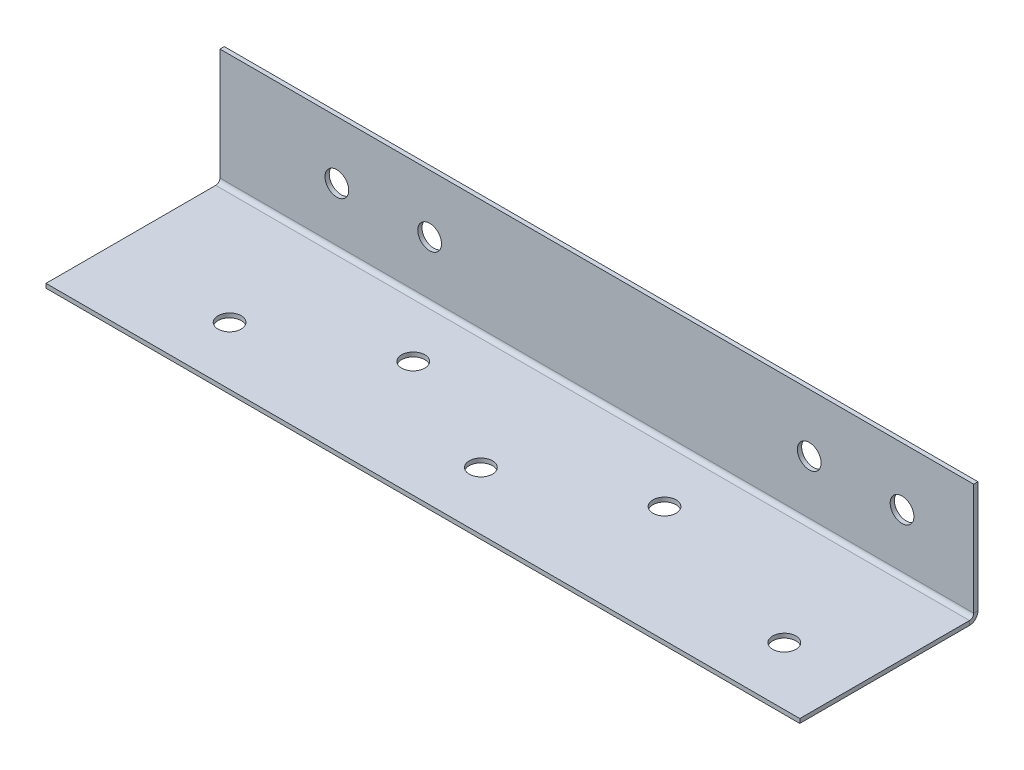
ISO-10303-21;
HEADER;
FILE_DESCRIPTION(('STEP AP214'),'2;1');
FILE_NAME('part.step','',(''),(''),'','','');
FILE_SCHEMA(('AUTOMOTIVE_DESIGN { 1 0 10303 214 1 1 1 1 }'));
ENDSEC;
DATA;
#1=APPLICATION_CONTEXT('core data for automotive mechanical design processes');
#2=APPLICATION_PROTOCOL_DEFINITION('international standard','automotive_design',2000,#1);
#3=PRODUCT_CONTEXT('',#1,'mechanical');
#4=PRODUCT('Part','Part','',(#3));
#5=PRODUCT_RELATED_PRODUCT_CATEGORY('part','',(#4));
#6=PRODUCT_DEFINITION_FORMATION('','',#4);
#7=PRODUCT_DEFINITION_CONTEXT('part definition',#1,'design');
#8=PRODUCT_DEFINITION('design','',#6,#7);
#9=PRODUCT_DEFINITION_SHAPE('','',#8);
#10=(LENGTH_UNIT() NAMED_UNIT(*) SI_UNIT(.MILLI.,.METRE.));
#11=(NAMED_UNIT(*) PLANE_ANGLE_UNIT() SI_UNIT($,.RADIAN.));
#12=(NAMED_UNIT(*) SI_UNIT($,.STERADIAN.) SOLID_ANGLE_UNIT());
#13=UNCERTAINTY_MEASURE_WITH_UNIT(LENGTH_MEASURE(1.E-05),#10,'distance_accuracy_value','');
#14=(GEOMETRIC_REPRESENTATION_CONTEXT(3) GLOBAL_UNCERTAINTY_ASSIGNED_CONTEXT((#13)) GLOBAL_UNIT_ASSIGNED_CONTEXT((#10,
#11,#12)) REPRESENTATION_CONTEXT('',''));
#15=CARTESIAN_POINT('',(0.,0.,0.));
#16=DIRECTION('',(0.,0.,1.));
#17=DIRECTION('',(1.,0.,0.));
#18=AXIS2_PLACEMENT_3D('',#15,#16,#17);
#19=CARTESIAN_POINT('',(-65.,-0.7366,15.));
#20=DIRECTION('',(-1.,0.,0.));
#21=DIRECTION('',(0.,0.,1.));
#22=AXIS2_PLACEMENT_3D('',#19,#20,#21);
#23=PLANE('',#22);
#24=DIRECTION('',(0.,0.,1.));
#25=VECTOR('',#24,1.);
#26=CARTESIAN_POINT('',(-65.,0.,15.));
#27=LINE('',#26,#25);
#28=CARTESIAN_POINT('',(-65.,0.,-14.2634));
#29=VERTEX_POINT('',#28);
#30=CARTESIAN_POINT('',(-65.,0.,15.));
#31=VERTEX_POINT('',#30);
#32=EDGE_CURVE('E89',#29,#31,#27,.T.);
#33=ORIENTED_EDGE('',*,*,#32,.F.);
#34=DIRECTION('',(0.,-1.,0.));
#35=VECTOR('',#34,1.);
#36=CARTESIAN_POINT('',(-65.,0.,-14.2634));
#37=LINE('',#36,#35);
#38=CARTESIAN_POINT('',(-65.,-0.736600000000018,-14.2634));
#39=VERTEX_POINT('',#38);
#40=EDGE_CURVE('E168',#29,#39,#37,.T.);
#41=ORIENTED_EDGE('',*,*,#40,.T.);
#42=DIRECTION('',(0.,0.,1.));
#43=VECTOR('',#42,1.);
#44=CARTESIAN_POINT('',(-65.,-0.7366,15.));
#45=LINE('',#44,#43);
#46=CARTESIAN_POINT('',(-65.,-0.7366,15.));
#47=VERTEX_POINT('',#46);
#48=EDGE_CURVE('E97',#39,#47,#45,.T.);
#49=ORIENTED_EDGE('',*,*,#48,.T.);
#50=DIRECTION('',(0.,1.,0.));
#51=VECTOR('',#50,1.);
#52=CARTESIAN_POINT('',(-65.,-0.7366,15.));
#53=LINE('',#52,#51);
#54=EDGE_CURVE('E48',#47,#31,#53,.T.);
#55=ORIENTED_EDGE('',*,*,#54,.T.);
#56=EDGE_LOOP('',(#33,#41,#49,#55));
#57=FACE_BOUND('',#56,.T.);
#58=ADVANCED_FACE('F39',(#57),#23,.T.);
#59=CARTESIAN_POINT('',(0.,-0.7366,0.));
#60=DIRECTION('',(0.,-1.,0.));
#61=DIRECTION('',(0.,0.,-1.));
#62=AXIS2_PLACEMENT_3D('',#59,#60,#61);
#63=PLANE('',#62);
#64=CARTESIAN_POINT('',(0.,-0.7366,5.));
#65=DIRECTION('',(0.,1.,0.));
#66=DIRECTION('',(0.,0.,1.));
#67=AXIS2_PLACEMENT_3D('',#64,#65,#66);
#68=CIRCLE('',#67,2.);
#69=CARTESIAN_POINT('',(0.,-0.7366,7.));
#70=VERTEX_POINT('',#69);
#71=EDGE_CURVE('E90',#70,#70,#68,.T.);
#72=ORIENTED_EDGE('',*,*,#71,.T.);
#73=EDGE_LOOP('',(#72));
#74=FACE_BOUND('',#73,.T.);
#75=CARTESIAN_POINT('',(-21.6666666666667,-0.7366,-5.));
#76=DIRECTION('',(0.,1.,0.));
#77=DIRECTION('',(0.,0.,1.));
#78=AXIS2_PLACEMENT_3D('',#75,#76,#77);
#79=CIRCLE('',#78,2.);
#80=CARTESIAN_POINT('',(-21.6666666666667,-0.7366,-2.99999999999999));
#81=VERTEX_POINT('',#80);
#82=EDGE_CURVE('E201',#81,#81,#79,.T.);
#83=ORIENTED_EDGE('',*,*,#82,.T.);
#84=EDGE_LOOP('',(#83));
#85=FACE_BOUND('',#84,.T.);
#86=CARTESIAN_POINT('',(-43.3333333333334,-0.7366,5.));
#87=DIRECTION('',(0.,1.,0.));
#88=DIRECTION('',(0.,0.,1.));
#89=AXIS2_PLACEMENT_3D('',#86,#87,#88);
#90=CIRCLE('',#89,2.);
#91=CARTESIAN_POINT('',(-43.3333333333334,-0.7366,7.00000000000001));
#92=VERTEX_POINT('',#91);
#93=EDGE_CURVE('E195',#92,#92,#90,.T.);
#94=ORIENTED_EDGE('',*,*,#93,.T.);
#95=EDGE_LOOP('',(#94));
#96=FACE_BOUND('',#95,.T.);
#97=CARTESIAN_POINT('',(52.33,-0.7366,5.));
#98=DIRECTION('',(0.,1.,0.));
#99=DIRECTION('',(0.,0.,1.));
#100=AXIS2_PLACEMENT_3D('',#97,#98,#99);
#101=CIRCLE('',#100,2.);
#102=CARTESIAN_POINT('',(52.33,-0.7366,7.00000000000001));
#103=VERTEX_POINT('',#102);
#104=EDGE_CURVE('E189',#103,#103,#101,.T.);
#105=ORIENTED_EDGE('',*,*,#104,.T.);
#106=EDGE_LOOP('',(#105));
#107=FACE_BOUND('',#106,.T.);
#108=CARTESIAN_POINT('',(21.67,-0.7366,-5.));
#109=DIRECTION('',(0.,1.,0.));
#110=DIRECTION('',(0.,0.,1.));
#111=AXIS2_PLACEMENT_3D('',#108,#109,#110);
#112=CIRCLE('',#111,2.);
#113=CARTESIAN_POINT('',(21.67,-0.7366,-2.99999999999999));
#114=VERTEX_POINT('',#113);
#115=EDGE_CURVE('E183',#114,#114,#112,.T.);
#116=ORIENTED_EDGE('',*,*,#115,.T.);
#117=EDGE_LOOP('',(#116));
#118=FACE_BOUND('',#117,.T.);
#119=ORIENTED_EDGE('',*,*,#48,.F.);
#120=DIRECTION('',(-1.,0.,0.));
#121=VECTOR('',#120,1.);
#122=CARTESIAN_POINT('',(-65.,-0.736600000000018,-14.2634));
#123=LINE('',#122,#121);
#124=CARTESIAN_POINT('',(65.,-0.7366,-14.2634));
#125=VERTEX_POINT('',#124);
#126=EDGE_CURVE('E163',#39,#125,#123,.F.);
#127=ORIENTED_EDGE('',*,*,#126,.T.);
#128=DIRECTION('',(0.,0.,-1.));
#129=VECTOR('',#128,1.);
#130=CARTESIAN_POINT('',(65.,-0.7366,15.));
#131=LINE('',#130,#129);
#132=CARTESIAN_POINT('',(65.,-0.7366,15.));
#133=VERTEX_POINT('',#132);
#134=EDGE_CURVE('E95',#133,#125,#131,.T.);
#135=ORIENTED_EDGE('',*,*,#134,.F.);
#136=DIRECTION('',(1.,0.,0.));
#137=VECTOR('',#136,1.);
#138=CARTESIAN_POINT('',(-65.,-0.7366,15.));
#139=LINE('',#138,#137);
#140=EDGE_CURVE('E81',#47,#133,#139,.T.);
#141=ORIENTED_EDGE('',*,*,#140,.F.);
#142=EDGE_LOOP('',(#119,#127,#135,#141));
#143=FACE_BOUND('',#142,.T.);
#144=ADVANCED_FACE('F216',(#74,#85,#96,#107,#118,#143),#63,.T.);
#145=CARTESIAN_POINT('',(0.,0.,0.));
#146=DIRECTION('',(0.,-1.,0.));
#147=DIRECTION('',(0.,0.,-1.));
#148=AXIS2_PLACEMENT_3D('',#145,#146,#147);
#149=PLANE('',#148);
#150=CARTESIAN_POINT('',(0.,0.,5.));
#151=DIRECTION('',(0.,1.,0.));
#152=DIRECTION('',(0.,0.,1.));
#153=AXIS2_PLACEMENT_3D('',#150,#151,#152);
#154=CIRCLE('',#153,2.);
#155=CARTESIAN_POINT('',(0.,0.,7.));
#156=VERTEX_POINT('',#155);
#157=EDGE_CURVE('E204',#156,#156,#154,.T.);
#158=ORIENTED_EDGE('',*,*,#157,.F.);
#159=EDGE_LOOP('',(#158));
#160=FACE_BOUND('',#159,.T.);
#161=CARTESIAN_POINT('',(-21.6666666666667,0.,-5.));
#162=DIRECTION('',(0.,1.,0.));
#163=DIRECTION('',(0.,0.,1.));
#164=AXIS2_PLACEMENT_3D('',#161,#162,#163);
#165=CIRCLE('',#164,2.);
#166=CARTESIAN_POINT('',(-21.6666666666667,0.,-2.99999999999999));
#167=VERTEX_POINT('',#166);
#168=EDGE_CURVE('E198',#167,#167,#165,.T.);
#169=ORIENTED_EDGE('',*,*,#168,.F.);
#170=EDGE_LOOP('',(#169));
#171=FACE_BOUND('',#170,.T.);
#172=CARTESIAN_POINT('',(-43.3333333333334,0.,5.));
#173=DIRECTION('',(0.,1.,0.));
#174=DIRECTION('',(0.,0.,1.));
#175=AXIS2_PLACEMENT_3D('',#172,#173,#174);
#176=CIRCLE('',#175,2.);
#177=CARTESIAN_POINT('',(-43.3333333333334,0.,7.00000000000001));
#178=VERTEX_POINT('',#177);
#179=EDGE_CURVE('E192',#178,#178,#176,.T.);
#180=ORIENTED_EDGE('',*,*,#179,.F.);
#181=EDGE_LOOP('',(#180));
#182=FACE_BOUND('',#181,.T.);
#183=CARTESIAN_POINT('',(52.33,0.,5.));
#184=DIRECTION('',(0.,1.,0.));
#185=DIRECTION('',(0.,0.,1.));
#186=AXIS2_PLACEMENT_3D('',#183,#184,#185);
#187=CIRCLE('',#186,2.);
#188=CARTESIAN_POINT('',(52.33,0.,7.00000000000001));
#189=VERTEX_POINT('',#188);
#190=EDGE_CURVE('E186',#189,#189,#187,.T.);
#191=ORIENTED_EDGE('',*,*,#190,.F.);
#192=EDGE_LOOP('',(#191));
#193=FACE_BOUND('',#192,.T.);
#194=CARTESIAN_POINT('',(21.67,0.,-5.));
#195=DIRECTION('',(0.,1.,0.));
#196=DIRECTION('',(0.,0.,1.));
#197=AXIS2_PLACEMENT_3D('',#194,#195,#196);
#198=CIRCLE('',#197,2.);
#199=CARTESIAN_POINT('',(21.67,0.,-2.99999999999999));
#200=VERTEX_POINT('',#199);
#201=EDGE_CURVE('E180',#200,#200,#198,.T.);
#202=ORIENTED_EDGE('',*,*,#201,.F.);
#203=EDGE_LOOP('',(#202));
#204=FACE_BOUND('',#203,.T.);
#205=DIRECTION('',(-1.,0.,0.));
#206=VECTOR('',#205,1.);
#207=CARTESIAN_POINT('',(-65.,0.,-14.2634));
#208=LINE('',#207,#206);
#209=CARTESIAN_POINT('',(65.,0.,-14.2634));
#210=VERTEX_POINT('',#209);
#211=EDGE_CURVE('E174',#29,#210,#208,.F.);
#212=ORIENTED_EDGE('',*,*,#211,.F.);
#213=ORIENTED_EDGE('',*,*,#32,.T.);
#214=DIRECTION('',(1.,0.,0.));
#215=VECTOR('',#214,1.);
#216=CARTESIAN_POINT('',(-65.,0.,15.));
#217=LINE('',#216,#215);
#218=CARTESIAN_POINT('',(65.,0.,15.));
#219=VERTEX_POINT('',#218);
#220=EDGE_CURVE('E79',#31,#219,#217,.T.);
#221=ORIENTED_EDGE('',*,*,#220,.T.);
#222=DIRECTION('',(0.,0.,-1.));
#223=VECTOR('',#222,1.);
#224=CARTESIAN_POINT('',(65.,0.,15.));
#225=LINE('',#224,#223);
#226=EDGE_CURVE('E84',#219,#210,#225,.T.);
#227=ORIENTED_EDGE('',*,*,#226,.T.);
#228=EDGE_LOOP('',(#212,#213,#221,#227));
#229=FACE_BOUND('',#228,.T.);
#230=ADVANCED_FACE('F92',(#160,#171,#182,#193,#204,#229),#149,.F.);
#231=CARTESIAN_POINT('',(65.,-0.7366,15.));
#232=DIRECTION('',(1.,0.,0.));
#233=DIRECTION('',(0.,0.,-1.));
#234=AXIS2_PLACEMENT_3D('',#231,#232,#233);
#235=PLANE('',#234);
#236=DIRECTION('',(0.,-1.,0.));
#237=VECTOR('',#236,1.);
#238=CARTESIAN_POINT('',(65.,0.,-14.2634));
#239=LINE('',#238,#237);
#240=EDGE_CURVE('E86',#210,#125,#239,.T.);
#241=ORIENTED_EDGE('',*,*,#240,.F.);
#242=ORIENTED_EDGE('',*,*,#226,.F.);
#243=DIRECTION('',(0.,1.,0.));
#244=VECTOR('',#243,1.);
#245=CARTESIAN_POINT('',(65.,-0.7366,15.));
#246=LINE('',#245,#244);
#247=EDGE_CURVE('E11',#133,#219,#246,.T.);
#248=ORIENTED_EDGE('',*,*,#247,.F.);
#249=ORIENTED_EDGE('',*,*,#134,.T.);
#250=EDGE_LOOP('',(#241,#242,#248,#249));
#251=FACE_BOUND('',#250,.T.);
#252=ADVANCED_FACE('F41',(#251),#235,.T.);
#253=CARTESIAN_POINT('',(-65.,-0.7366,15.));
#254=DIRECTION('',(0.,0.,1.));
#255=DIRECTION('',(1.,0.,0.));
#256=AXIS2_PLACEMENT_3D('',#253,#254,#255);
#257=PLANE('',#256);
#258=ORIENTED_EDGE('',*,*,#220,.F.);
#259=ORIENTED_EDGE('',*,*,#54,.F.);
#260=ORIENTED_EDGE('',*,*,#140,.T.);
#261=ORIENTED_EDGE('',*,*,#247,.T.);
#262=EDGE_LOOP('',(#258,#259,#260,#261));
#263=FACE_BOUND('',#262,.T.);
#264=ADVANCED_FACE('F76',(#263),#257,.T.);
#265=CARTESIAN_POINT('',(0.,-0.7366,5.));
#266=DIRECTION('',(0.,1.,0.));
#267=DIRECTION('',(0.,0.,1.));
#268=AXIS2_PLACEMENT_3D('',#265,#266,#267);
#269=CYLINDRICAL_SURFACE('',#268,2.);
#270=ORIENTED_EDGE('',*,*,#71,.F.);
#271=EDGE_LOOP('',(#270));
#272=FACE_BOUND('',#271,.T.);
#273=ORIENTED_EDGE('',*,*,#157,.T.);
#274=EDGE_LOOP('',(#273));
#275=FACE_BOUND('',#274,.T.);
#276=ADVANCED_FACE('F289',(#272,#275),#269,.F.);
#277=CARTESIAN_POINT('',(-21.6666666666667,-0.7366,-5.));
#278=DIRECTION('',(0.,1.,0.));
#279=DIRECTION('',(0.,0.,1.));
#280=AXIS2_PLACEMENT_3D('',#277,#278,#279);
#281=CYLINDRICAL_SURFACE('',#280,2.);
#282=ORIENTED_EDGE('',*,*,#82,.F.);
#283=EDGE_LOOP('',(#282));
#284=FACE_BOUND('',#283,.T.);
#285=ORIENTED_EDGE('',*,*,#168,.T.);
#286=EDGE_LOOP('',(#285));
#287=FACE_BOUND('',#286,.T.);
#288=ADVANCED_FACE('F295',(#284,#287),#281,.F.);
#289=CARTESIAN_POINT('',(-43.3333333333334,-0.7366,5.));
#290=DIRECTION('',(0.,1.,0.));
#291=DIRECTION('',(0.,0.,1.));
#292=AXIS2_PLACEMENT_3D('',#289,#290,#291);
#293=CYLINDRICAL_SURFACE('',#292,2.);
#294=ORIENTED_EDGE('',*,*,#93,.F.);
#295=EDGE_LOOP('',(#294));
#296=FACE_BOUND('',#295,.T.);
#297=ORIENTED_EDGE('',*,*,#179,.T.);
#298=EDGE_LOOP('',(#297));
#299=FACE_BOUND('',#298,.T.);
#300=ADVANCED_FACE('F299',(#296,#299),#293,.F.);
#301=CARTESIAN_POINT('',(52.33,-0.7366,5.));
#302=DIRECTION('',(0.,1.,0.));
#303=DIRECTION('',(0.,0.,1.));
#304=AXIS2_PLACEMENT_3D('',#301,#302,#303);
#305=CYLINDRICAL_SURFACE('',#304,2.);
#306=ORIENTED_EDGE('',*,*,#104,.F.);
#307=EDGE_LOOP('',(#306));
#308=FACE_BOUND('',#307,.T.);
#309=ORIENTED_EDGE('',*,*,#190,.T.);
#310=EDGE_LOOP('',(#309));
#311=FACE_BOUND('',#310,.T.);
#312=ADVANCED_FACE('F276',(#308,#311),#305,.F.);
#313=CARTESIAN_POINT('',(21.67,-0.7366,-5.));
#314=DIRECTION('',(0.,1.,0.));
#315=DIRECTION('',(0.,0.,1.));
#316=AXIS2_PLACEMENT_3D('',#313,#314,#315);
#317=CYLINDRICAL_SURFACE('',#316,2.);
#318=ORIENTED_EDGE('',*,*,#115,.F.);
#319=EDGE_LOOP('',(#318));
#320=FACE_BOUND('',#319,.T.);
#321=ORIENTED_EDGE('',*,*,#201,.T.);
#322=EDGE_LOOP('',(#321));
#323=FACE_BOUND('',#322,.T.);
#324=ADVANCED_FACE('F269',(#320,#323),#317,.F.);
#325=CARTESIAN_POINT('',(65.,0.736599999999992,-14.2634));
#326=DIRECTION('',(1.,0.,0.));
#327=DIRECTION('',(0.,1.,0.));
#328=AXIS2_PLACEMENT_3D('',#325,#326,#327);
#329=PLANE('',#328);
#330=DIRECTION('',(0.,0.,-1.));
#331=VECTOR('',#330,1.);
#332=CARTESIAN_POINT('',(65.,0.736599999999997,-15.));
#333=LINE('',#332,#331);
#334=CARTESIAN_POINT('',(65.,0.73659999999999,-15.));
#335=VERTEX_POINT('',#334);
#336=CARTESIAN_POINT('',(65.,0.736599999999987,-15.7366));
#337=VERTEX_POINT('',#336);
#338=EDGE_CURVE('E127',#335,#337,#333,.T.);
#339=ORIENTED_EDGE('',*,*,#338,.F.);
#340=CARTESIAN_POINT('',(65.,0.736599999999992,-14.2634));
#341=DIRECTION('',(-1.,0.,0.));
#342=DIRECTION('',(0.,-1.,0.));
#343=AXIS2_PLACEMENT_3D('',#340,#341,#342);
#344=CIRCLE('',#343,0.7366);
#345=EDGE_CURVE('E171',#210,#335,#344,.F.);
#346=ORIENTED_EDGE('',*,*,#345,.F.);
#347=ORIENTED_EDGE('',*,*,#240,.T.);
#348=CARTESIAN_POINT('',(65.,0.736599999999992,-14.2634));
#349=DIRECTION('',(-1.,0.,0.));
#350=DIRECTION('',(0.,-1.,0.));
#351=AXIS2_PLACEMENT_3D('',#348,#349,#350);
#352=CIRCLE('',#351,1.4732);
#353=EDGE_CURVE('E56',#125,#337,#352,.F.);
#354=ORIENTED_EDGE('',*,*,#353,.T.);
#355=EDGE_LOOP('',(#339,#346,#347,#354));
#356=FACE_BOUND('',#355,.T.);
#357=ADVANCED_FACE('F267',(#356),#329,.T.);
#358=CARTESIAN_POINT('',(-65.,0.736599999999983,-14.2634));
#359=DIRECTION('',(1.,0.,0.));
#360=DIRECTION('',(0.,1.,0.));
#361=AXIS2_PLACEMENT_3D('',#358,#359,#360);
#362=PLANE('',#361);
#363=CARTESIAN_POINT('',(-65.,0.736599999999983,-14.2634));
#364=DIRECTION('',(-1.,0.,0.));
#365=DIRECTION('',(0.,-1.,0.));
#366=AXIS2_PLACEMENT_3D('',#363,#364,#365);
#367=CIRCLE('',#366,0.7366);
#368=CARTESIAN_POINT('',(-65.,0.73659999999998,-15.));
#369=VERTEX_POINT('',#368);
#370=EDGE_CURVE('E162',#369,#29,#367,.T.);
#371=ORIENTED_EDGE('',*,*,#370,.F.);
#372=DIRECTION('',(0.,0.,-1.));
#373=VECTOR('',#372,1.);
#374=CARTESIAN_POINT('',(-65.,0.736599999999988,-15.));
#375=LINE('',#374,#373);
#376=CARTESIAN_POINT('',(-65.,0.736599999999993,-15.7366));
#377=VERTEX_POINT('',#376);
#378=EDGE_CURVE('E131',#369,#377,#375,.T.);
#379=ORIENTED_EDGE('',*,*,#378,.T.);
#380=CARTESIAN_POINT('',(-65.,0.736599999999983,-14.2634));
#381=DIRECTION('',(-1.,0.,0.));
#382=DIRECTION('',(0.,-1.,0.));
#383=AXIS2_PLACEMENT_3D('',#380,#381,#382);
#384=CIRCLE('',#383,1.4732);
#385=EDGE_CURVE('E166',#377,#39,#384,.T.);
#386=ORIENTED_EDGE('',*,*,#385,.T.);
#387=ORIENTED_EDGE('',*,*,#40,.F.);
#388=EDGE_LOOP('',(#371,#379,#386,#387));
#389=FACE_BOUND('',#388,.T.);
#390=ADVANCED_FACE('F224',(#389),#362,.F.);
#391=CARTESIAN_POINT('',(-65.,0.736599999999983,-14.2634));
#392=DIRECTION('',(-1.,0.,0.));
#393=DIRECTION('',(0.,0.,-1.));
#394=AXIS2_PLACEMENT_3D('',#391,#392,#393);
#395=CYLINDRICAL_SURFACE('',#394,1.4732);
#396=ORIENTED_EDGE('',*,*,#126,.F.);
#397=ORIENTED_EDGE('',*,*,#385,.F.);
#398=DIRECTION('',(1.,0.,0.));
#399=VECTOR('',#398,1.);
#400=CARTESIAN_POINT('',(0.,0.736599999999998,-15.7366));
#401=LINE('',#400,#399);
#402=EDGE_CURVE('E134',#377,#337,#401,.T.);
#403=ORIENTED_EDGE('',*,*,#402,.T.);
#404=ORIENTED_EDGE('',*,*,#353,.F.);
#405=EDGE_LOOP('',(#396,#397,#403,#404));
#406=FACE_BOUND('',#405,.T.);
#407=ADVANCED_FACE('F218',(#406),#395,.T.);
#408=CARTESIAN_POINT('',(-65.,0.736599999999983,-14.2634));
#409=DIRECTION('',(-1.,0.,0.));
#410=DIRECTION('',(0.,0.,-1.));
#411=AXIS2_PLACEMENT_3D('',#408,#409,#410);
#412=CYLINDRICAL_SURFACE('',#411,0.7366);
#413=ORIENTED_EDGE('',*,*,#211,.T.);
#414=ORIENTED_EDGE('',*,*,#345,.T.);
#415=DIRECTION('',(-1.,0.,0.));
#416=VECTOR('',#415,1.);
#417=CARTESIAN_POINT('',(65.,0.736599999999997,-15.));
#418=LINE('',#417,#416);
#419=EDGE_CURVE('E128',#335,#369,#418,.T.);
#420=ORIENTED_EDGE('',*,*,#419,.T.);
#421=ORIENTED_EDGE('',*,*,#370,.T.);
#422=EDGE_LOOP('',(#413,#414,#420,#421));
#423=FACE_BOUND('',#422,.T.);
#424=ADVANCED_FACE('F259',(#423),#412,.F.);
#425=CARTESIAN_POINT('',(65.,0.,-15.7366));
#426=DIRECTION('',(-1.,0.,0.));
#427=DIRECTION('',(0.,0.,1.));
#428=AXIS2_PLACEMENT_3D('',#425,#426,#427);
#429=PLANE('',#428);
#430=ORIENTED_EDGE('',*,*,#338,.T.);
#431=DIRECTION('',(0.,-1.,0.));
#432=VECTOR('',#431,1.);
#433=CARTESIAN_POINT('',(65.,0.,-15.7366));
#434=LINE('',#433,#432);
#435=CARTESIAN_POINT('',(65.,20.,-15.7366000000001));
#436=VERTEX_POINT('',#435);
#437=EDGE_CURVE('E139',#436,#337,#434,.T.);
#438=ORIENTED_EDGE('',*,*,#437,.F.);
#439=DIRECTION('',(0.,0.,1.));
#440=VECTOR('',#439,1.);
#441=CARTESIAN_POINT('',(65.,20.,-15.7366000000001));
#442=LINE('',#441,#440);
#443=CARTESIAN_POINT('',(65.,20.,-15.0000000000001));
#444=VERTEX_POINT('',#443);
#445=EDGE_CURVE('E149',#436,#444,#442,.T.);
#446=ORIENTED_EDGE('',*,*,#445,.T.);
#447=DIRECTION('',(0.,-1.,0.));
#448=VECTOR('',#447,1.);
#449=CARTESIAN_POINT('',(65.,0.,-15.));
#450=LINE('',#449,#448);
#451=EDGE_CURVE('E138',#444,#335,#450,.T.);
#452=ORIENTED_EDGE('',*,*,#451,.T.);
#453=EDGE_LOOP('',(#430,#438,#446,#452));
#454=FACE_BOUND('',#453,.T.);
#455=ADVANCED_FACE('F265',(#454),#429,.F.);
#456=CARTESIAN_POINT('',(-65.,20.,-15.7366000000001));
#457=DIRECTION('',(1.,0.,0.));
#458=DIRECTION('',(0.,0.,-1.));
#459=AXIS2_PLACEMENT_3D('',#456,#457,#458);
#460=PLANE('',#459);
#461=ORIENTED_EDGE('',*,*,#378,.F.);
#462=DIRECTION('',(0.,1.,0.));
#463=VECTOR('',#462,1.);
#464=CARTESIAN_POINT('',(-65.,20.,-15.0000000000001));
#465=LINE('',#464,#463);
#466=CARTESIAN_POINT('',(-65.,20.,-15.0000000000001));
#467=VERTEX_POINT('',#466);
#468=EDGE_CURVE('E152',#369,#467,#465,.T.);
#469=ORIENTED_EDGE('',*,*,#468,.T.);
#470=DIRECTION('',(0.,0.,1.));
#471=VECTOR('',#470,1.);
#472=CARTESIAN_POINT('',(-65.,20.,-15.7366000000001));
#473=LINE('',#472,#471);
#474=CARTESIAN_POINT('',(-65.,20.,-15.7366000000001));
#475=VERTEX_POINT('',#474);
#476=EDGE_CURVE('E159',#475,#467,#473,.T.);
#477=ORIENTED_EDGE('',*,*,#476,.F.);
#478=DIRECTION('',(0.,1.,0.));
#479=VECTOR('',#478,1.);
#480=CARTESIAN_POINT('',(-65.,20.,-15.7366000000001));
#481=LINE('',#480,#479);
#482=EDGE_CURVE('E142',#377,#475,#481,.T.);
#483=ORIENTED_EDGE('',*,*,#482,.F.);
#484=EDGE_LOOP('',(#461,#469,#477,#483));
#485=FACE_BOUND('',#484,.T.);
#486=ADVANCED_FACE('F239',(#485),#460,.F.);
#487=CARTESIAN_POINT('',(0.,0.,-15.7366));
#488=DIRECTION('',(0.,0.,1.));
#489=DIRECTION('',(0.,-1.,0.));
#490=AXIS2_PLACEMENT_3D('',#487,#488,#489);
#491=PLANE('',#490);
#492=CARTESIAN_POINT('',(-44.8386625660338,9.99999999999999,-15.7366));
#493=DIRECTION('',(0.,0.,1.));
#494=DIRECTION('',(0.,-1.,0.));
#495=AXIS2_PLACEMENT_3D('',#492,#493,#494);
#496=CIRCLE('',#495,2.04999999999788);
#497=CARTESIAN_POINT('',(-44.8386625660338,7.95000000000211,-15.7366));
#498=VERTEX_POINT('',#497);
#499=EDGE_CURVE('E112',#498,#498,#496,.T.);
#500=ORIENTED_EDGE('',*,*,#499,.T.);
#501=EDGE_LOOP('',(#500));
#502=FACE_BOUND('',#501,.T.);
#503=CARTESIAN_POINT('',(-28.838662566033,10.0000000000014,-15.7366));
#504=DIRECTION('',(0.,0.,1.));
#505=DIRECTION('',(0.,-1.,0.));
#506=AXIS2_PLACEMENT_3D('',#503,#504,#505);
#507=CIRCLE('',#506,2.05000000000059);
#508=CARTESIAN_POINT('',(-28.838662566033,7.95000000000081,-15.7366));
#509=VERTEX_POINT('',#508);
#510=EDGE_CURVE('E109',#509,#509,#507,.T.);
#511=ORIENTED_EDGE('',*,*,#510,.T.);
#512=EDGE_LOOP('',(#511));
#513=FACE_BOUND('',#512,.T.);
#514=CARTESIAN_POINT('',(52.6345374339648,10.000000000001,-15.7366));
#515=DIRECTION('',(0.,0.,1.));
#516=DIRECTION('',(0.,-1.,0.));
#517=AXIS2_PLACEMENT_3D('',#514,#515,#516);
#518=CIRCLE('',#517,2.04999999999783);
#519=CARTESIAN_POINT('',(52.6345374339648,7.9500000000032,-15.7366));
#520=VERTEX_POINT('',#519);
#521=EDGE_CURVE('E106',#520,#520,#518,.T.);
#522=ORIENTED_EDGE('',*,*,#521,.T.);
#523=EDGE_LOOP('',(#522));
#524=FACE_BOUND('',#523,.T.);
#525=CARTESIAN_POINT('',(36.6345374339684,9.99999999999967,-15.7366));
#526=DIRECTION('',(0.,0.,1.));
#527=DIRECTION('',(0.,-1.,0.));
#528=AXIS2_PLACEMENT_3D('',#525,#526,#527);
#529=CIRCLE('',#528,2.05000000000058);
#530=CARTESIAN_POINT('',(36.6345374339684,7.94999999999909,-15.7366));
#531=VERTEX_POINT('',#530);
#532=EDGE_CURVE('E105',#531,#531,#529,.T.);
#533=ORIENTED_EDGE('',*,*,#532,.T.);
#534=EDGE_LOOP('',(#533));
#535=FACE_BOUND('',#534,.T.);
#536=ORIENTED_EDGE('',*,*,#402,.F.);
#537=ORIENTED_EDGE('',*,*,#482,.T.);
#538=DIRECTION('',(1.,0.,0.));
#539=VECTOR('',#538,1.);
#540=CARTESIAN_POINT('',(65.,20.,-15.7366000000001));
#541=LINE('',#540,#539);
#542=EDGE_CURVE('E146',#475,#436,#541,.T.);
#543=ORIENTED_EDGE('',*,*,#542,.T.);
#544=ORIENTED_EDGE('',*,*,#437,.T.);
#545=EDGE_LOOP('',(#536,#537,#543,#544));
#546=FACE_BOUND('',#545,.T.);
#547=ADVANCED_FACE('F235',(#502,#513,#524,#535,#546),#491,.F.);
#548=CARTESIAN_POINT('',(0.,0.,-15.));
#549=DIRECTION('',(0.,0.,1.));
#550=DIRECTION('',(0.,-1.,0.));
#551=AXIS2_PLACEMENT_3D('',#548,#549,#550);
#552=PLANE('',#551);
#553=CARTESIAN_POINT('',(-44.8386625660338,9.99999999999999,-15.));
#554=DIRECTION('',(0.,0.,1.));
#555=DIRECTION('',(0.,-1.,0.));
#556=AXIS2_PLACEMENT_3D('',#553,#554,#555);
#557=CIRCLE('',#556,2.04999999999788);
#558=CARTESIAN_POINT('',(-44.8386625660338,7.95000000000211,-15.));
#559=VERTEX_POINT('',#558);
#560=EDGE_CURVE('E43',#559,#559,#557,.T.);
#561=ORIENTED_EDGE('',*,*,#560,.F.);
#562=EDGE_LOOP('',(#561));
#563=FACE_BOUND('',#562,.T.);
#564=CARTESIAN_POINT('',(-28.838662566033,10.0000000000014,-15.));
#565=DIRECTION('',(0.,0.,1.));
#566=DIRECTION('',(0.,-1.,0.));
#567=AXIS2_PLACEMENT_3D('',#564,#565,#566);
#568=CIRCLE('',#567,2.05000000000059);
#569=CARTESIAN_POINT('',(-28.838662566033,7.95000000000081,-15.));
#570=VERTEX_POINT('',#569);
#571=EDGE_CURVE('E110',#570,#570,#568,.T.);
#572=ORIENTED_EDGE('',*,*,#571,.F.);
#573=EDGE_LOOP('',(#572));
#574=FACE_BOUND('',#573,.T.);
#575=CARTESIAN_POINT('',(52.6345374339648,10.000000000001,-15.));
#576=DIRECTION('',(0.,0.,1.));
#577=DIRECTION('',(0.,-1.,0.));
#578=AXIS2_PLACEMENT_3D('',#575,#576,#577);
#579=CIRCLE('',#578,2.04999999999783);
#580=CARTESIAN_POINT('',(52.6345374339648,7.9500000000032,-15.));
#581=VERTEX_POINT('',#580);
#582=EDGE_CURVE('E107',#581,#581,#579,.T.);
#583=ORIENTED_EDGE('',*,*,#582,.F.);
#584=EDGE_LOOP('',(#583));
#585=FACE_BOUND('',#584,.T.);
#586=CARTESIAN_POINT('',(36.6345374339684,9.99999999999967,-15.));
#587=DIRECTION('',(0.,0.,1.));
#588=DIRECTION('',(0.,-1.,0.));
#589=AXIS2_PLACEMENT_3D('',#586,#587,#588);
#590=CIRCLE('',#589,2.05000000000058);
#591=CARTESIAN_POINT('',(36.6345374339684,7.94999999999909,-15.));
#592=VERTEX_POINT('',#591);
#593=EDGE_CURVE('E102',#592,#592,#590,.T.);
#594=ORIENTED_EDGE('',*,*,#593,.F.);
#595=EDGE_LOOP('',(#594));
#596=FACE_BOUND('',#595,.T.);
#597=ORIENTED_EDGE('',*,*,#468,.F.);
#598=ORIENTED_EDGE('',*,*,#419,.F.);
#599=ORIENTED_EDGE('',*,*,#451,.F.);
#600=DIRECTION('',(1.,0.,0.));
#601=VECTOR('',#600,1.);
#602=CARTESIAN_POINT('',(65.,20.,-15.0000000000001));
#603=LINE('',#602,#601);
#604=EDGE_CURVE('E143',#467,#444,#603,.T.);
#605=ORIENTED_EDGE('',*,*,#604,.F.);
#606=EDGE_LOOP('',(#597,#598,#599,#605));
#607=FACE_BOUND('',#606,.T.);
#608=ADVANCED_FACE('F263',(#563,#574,#585,#596,#607),#552,.T.);
#609=CARTESIAN_POINT('',(65.,20.,-15.7366000000001));
#610=DIRECTION('',(0.,-1.,0.));
#611=DIRECTION('',(0.,0.,-1.));
#612=AXIS2_PLACEMENT_3D('',#609,#610,#611);
#613=PLANE('',#612);
#614=ORIENTED_EDGE('',*,*,#604,.T.);
#615=ORIENTED_EDGE('',*,*,#445,.F.);
#616=ORIENTED_EDGE('',*,*,#542,.F.);
#617=ORIENTED_EDGE('',*,*,#476,.T.);
#618=EDGE_LOOP('',(#614,#615,#616,#617));
#619=FACE_BOUND('',#618,.T.);
#620=ADVANCED_FACE('F247',(#619),#613,.F.);
#621=CARTESIAN_POINT('',(36.6345374339683,9.99999999999967,15.0000000000003));
#622=DIRECTION('',(0.,0.,-1.));
#623=DIRECTION('',(-1.,0.,0.));
#624=AXIS2_PLACEMENT_3D('',#621,#622,#623);
#625=CYLINDRICAL_SURFACE('',#624,2.05000000000058);
#626=ORIENTED_EDGE('',*,*,#593,.T.);
#627=EDGE_LOOP('',(#626));
#628=FACE_BOUND('',#627,.T.);
#629=ORIENTED_EDGE('',*,*,#532,.F.);
#630=EDGE_LOOP('',(#629));
#631=FACE_BOUND('',#630,.T.);
#632=ADVANCED_FACE('F408',(#628,#631),#625,.F.);
#633=CARTESIAN_POINT('',(52.6345374339647,10.000000000001,15.0000000000004));
#634=DIRECTION('',(0.,0.,-1.));
#635=DIRECTION('',(-1.,0.,0.));
#636=AXIS2_PLACEMENT_3D('',#633,#634,#635);
#637=CYLINDRICAL_SURFACE('',#636,2.04999999999783);
#638=ORIENTED_EDGE('',*,*,#582,.T.);
#639=EDGE_LOOP('',(#638));
#640=FACE_BOUND('',#639,.T.);
#641=ORIENTED_EDGE('',*,*,#521,.F.);
#642=EDGE_LOOP('',(#641));
#643=FACE_BOUND('',#642,.T.);
#644=ADVANCED_FACE('F429',(#640,#643),#637,.F.);
#645=CARTESIAN_POINT('',(-28.8386625660331,10.0000000000014,15.0000000000001));
#646=DIRECTION('',(0.,0.,-1.));
#647=DIRECTION('',(-1.,0.,0.));
#648=AXIS2_PLACEMENT_3D('',#645,#646,#647);
#649=CYLINDRICAL_SURFACE('',#648,2.05000000000059);
#650=ORIENTED_EDGE('',*,*,#571,.T.);
#651=EDGE_LOOP('',(#650));
#652=FACE_BOUND('',#651,.T.);
#653=ORIENTED_EDGE('',*,*,#510,.F.);
#654=EDGE_LOOP('',(#653));
#655=FACE_BOUND('',#654,.T.);
#656=ADVANCED_FACE('F439',(#652,#655),#649,.F.);
#657=CARTESIAN_POINT('',(-44.8386625660339,9.99999999999999,15.0000000000001));
#658=DIRECTION('',(0.,0.,-1.));
#659=DIRECTION('',(-1.,0.,0.));
#660=AXIS2_PLACEMENT_3D('',#657,#658,#659);
#661=CYLINDRICAL_SURFACE('',#660,2.04999999999788);
#662=ORIENTED_EDGE('',*,*,#560,.T.);
#663=EDGE_LOOP('',(#662));
#664=FACE_BOUND('',#663,.T.);
#665=ORIENTED_EDGE('',*,*,#499,.F.);
#666=EDGE_LOOP('',(#665));
#667=FACE_BOUND('',#666,.T.);
#668=ADVANCED_FACE('F449',(#664,#667),#661,.F.);
#669=CLOSED_SHELL('',(#58,#144,#230,#252,#264,#276,#288,#300,#312,#324,#357,#390,#407,#424,#455,
#486,#547,#608,#620,#632,#644,#656,#668));
#670=MANIFOLD_SOLID_BREP('B2',#669);
#671=ADVANCED_BREP_SHAPE_REPRESENTATION('',(#18,#670),#14);
#672=SHAPE_DEFINITION_REPRESENTATION(#9,#671);
ENDSEC;
END-ISO-10303-21;
